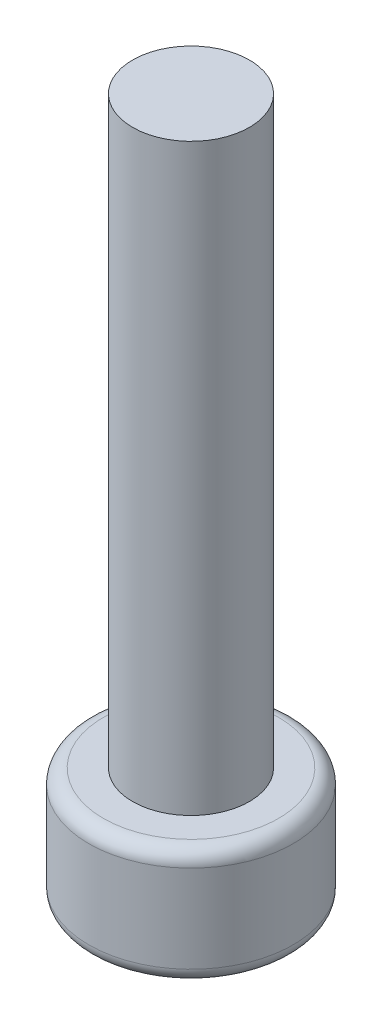
ISO-10303-21;
HEADER;
FILE_DESCRIPTION(('STEP AP214'),'2;1');
FILE_NAME('part.step','',(''),(''),'','','');
FILE_SCHEMA(('AUTOMOTIVE_DESIGN { 1 0 10303 214 1 1 1 1 }'));
ENDSEC;
DATA;
#1=APPLICATION_CONTEXT('core data for automotive mechanical design processes');
#2=APPLICATION_PROTOCOL_DEFINITION('international standard','automotive_design',2000,#1);
#3=PRODUCT_CONTEXT('',#1,'mechanical');
#4=PRODUCT('Part','Part','',(#3));
#5=PRODUCT_RELATED_PRODUCT_CATEGORY('part','',(#4));
#6=PRODUCT_DEFINITION_FORMATION('','',#4);
#7=PRODUCT_DEFINITION_CONTEXT('part definition',#1,'design');
#8=PRODUCT_DEFINITION('design','',#6,#7);
#9=PRODUCT_DEFINITION_SHAPE('','',#8);
#10=(LENGTH_UNIT() NAMED_UNIT(*) SI_UNIT(.MILLI.,.METRE.));
#11=(NAMED_UNIT(*) PLANE_ANGLE_UNIT() SI_UNIT($,.RADIAN.));
#12=(NAMED_UNIT(*) SI_UNIT($,.STERADIAN.) SOLID_ANGLE_UNIT());
#13=UNCERTAINTY_MEASURE_WITH_UNIT(LENGTH_MEASURE(1.E-05),#10,'distance_accuracy_value','');
#14=(GEOMETRIC_REPRESENTATION_CONTEXT(3) GLOBAL_UNCERTAINTY_ASSIGNED_CONTEXT((#13)) GLOBAL_UNIT_ASSIGNED_CONTEXT((#10,
#11,#12)) REPRESENTATION_CONTEXT('',''));
#15=CARTESIAN_POINT('',(0.,0.,0.));
#16=DIRECTION('',(0.,0.,1.));
#17=DIRECTION('',(1.,0.,0.));
#18=AXIS2_PLACEMENT_3D('',#15,#16,#17);
#19=CARTESIAN_POINT('',(0.,4.,0.));
#20=DIRECTION('',(0.,-1.,0.));
#21=DIRECTION('',(0.,0.,-1.));
#22=AXIS2_PLACEMENT_3D('',#19,#20,#21);
#23=CYLINDRICAL_SURFACE('',#22,3.5);
#24=CARTESIAN_POINT('',(0.,0.5,0.));
#25=DIRECTION('',(0.,1.,0.));
#26=DIRECTION('',(0.,0.,1.));
#27=AXIS2_PLACEMENT_3D('',#24,#25,#26);
#28=CIRCLE('',#27,3.5);
#29=CARTESIAN_POINT('',(0.,0.5,3.5));
#30=VERTEX_POINT('',#29);
#31=EDGE_CURVE('E154',#30,#30,#28,.T.);
#32=ORIENTED_EDGE('',*,*,#31,.T.);
#33=EDGE_LOOP('',(#32));
#34=FACE_BOUND('',#33,.T.);
#35=CARTESIAN_POINT('',(0.,3.5,0.));
#36=DIRECTION('',(0.,1.,0.));
#37=DIRECTION('',(0.,0.,1.));
#38=AXIS2_PLACEMENT_3D('',#35,#36,#37);
#39=CIRCLE('',#38,3.5);
#40=CARTESIAN_POINT('',(0.,3.5,3.5));
#41=VERTEX_POINT('',#40);
#42=EDGE_CURVE('E151',#41,#41,#39,.F.);
#43=ORIENTED_EDGE('',*,*,#42,.T.);
#44=EDGE_LOOP('',(#43));
#45=FACE_BOUND('',#44,.T.);
#46=ADVANCED_FACE('F38',(#34,#45),#23,.T.);
#47=CARTESIAN_POINT('',(0.,4.,0.));
#48=DIRECTION('',(0.,1.,0.));
#49=DIRECTION('',(0.,0.,1.));
#50=AXIS2_PLACEMENT_3D('',#47,#48,#49);
#51=PLANE('',#50);
#52=CARTESIAN_POINT('',(0.,4.,0.));
#53=DIRECTION('',(0.,1.,0.));
#54=DIRECTION('',(0.,0.,1.));
#55=AXIS2_PLACEMENT_3D('',#52,#53,#54);
#56=CIRCLE('',#55,3.);
#57=CARTESIAN_POINT('',(0.,4.,3.));
#58=VERTEX_POINT('',#57);
#59=EDGE_CURVE('E11',#58,#58,#56,.T.);
#60=ORIENTED_EDGE('',*,*,#59,.T.);
#61=EDGE_LOOP('',(#60));
#62=FACE_BOUND('',#61,.T.);
#63=CARTESIAN_POINT('',(0.,4.,0.));
#64=DIRECTION('',(0.,1.,0.));
#65=DIRECTION('',(0.,0.,1.));
#66=AXIS2_PLACEMENT_3D('',#63,#64,#65);
#67=CIRCLE('',#66,2.);
#68=CARTESIAN_POINT('',(0.,4.,2.));
#69=VERTEX_POINT('',#68);
#70=EDGE_CURVE('E148',#69,#69,#67,.T.);
#71=ORIENTED_EDGE('',*,*,#70,.F.);
#72=EDGE_LOOP('',(#71));
#73=FACE_BOUND('',#72,.T.);
#74=ADVANCED_FACE('F169',(#62,#73),#51,.T.);
#75=CARTESIAN_POINT('',(0.,0.,0.));
#76=DIRECTION('',(0.,1.,0.));
#77=DIRECTION('',(0.,0.,1.));
#78=AXIS2_PLACEMENT_3D('',#75,#76,#77);
#79=PLANE('',#78);
#80=CARTESIAN_POINT('',(0.,0.,0.));
#81=DIRECTION('',(0.,1.,0.));
#82=DIRECTION('',(0.,0.,1.));
#83=AXIS2_PLACEMENT_3D('',#80,#81,#82);
#84=CIRCLE('',#83,3.);
#85=CARTESIAN_POINT('',(0.,0.,3.));
#86=VERTEX_POINT('',#85);
#87=EDGE_CURVE('E46',#86,#86,#84,.F.);
#88=ORIENTED_EDGE('',*,*,#87,.T.);
#89=EDGE_LOOP('',(#88));
#90=FACE_BOUND('',#89,.T.);
#91=DIRECTION('',(-0.5,0.,0.866025403784439));
#92=VECTOR('',#91,1.);
#93=CARTESIAN_POINT('',(1.5,0.,0.));
#94=LINE('',#93,#92);
#95=CARTESIAN_POINT('',(1.5,0.,0.));
#96=VERTEX_POINT('',#95);
#97=CARTESIAN_POINT('',(0.749999999999999,0.,1.29903810567666));
#98=VERTEX_POINT('',#97);
#99=EDGE_CURVE('E127',#96,#98,#94,.T.);
#100=ORIENTED_EDGE('',*,*,#99,.F.);
#101=DIRECTION('',(0.499999999999999,0.,0.866025403784439));
#102=VECTOR('',#101,1.);
#103=CARTESIAN_POINT('',(0.75,0.,-1.29903810567666));
#104=LINE('',#103,#102);
#105=CARTESIAN_POINT('',(0.75,0.,-1.29903810567666));
#106=VERTEX_POINT('',#105);
#107=EDGE_CURVE('E53',#106,#96,#104,.T.);
#108=ORIENTED_EDGE('',*,*,#107,.F.);
#109=DIRECTION('',(1.,0.,0.));
#110=VECTOR('',#109,1.);
#111=CARTESIAN_POINT('',(-0.75,0.,-1.29903810567666));
#112=LINE('',#111,#110);
#113=CARTESIAN_POINT('',(-0.75,0.,-1.29903810567666));
#114=VERTEX_POINT('',#113);
#115=EDGE_CURVE('E136',#114,#106,#112,.T.);
#116=ORIENTED_EDGE('',*,*,#115,.F.);
#117=DIRECTION('',(0.5,0.,-0.866025403784439));
#118=VECTOR('',#117,1.);
#119=CARTESIAN_POINT('',(-1.5,0.,0.));
#120=LINE('',#119,#118);
#121=CARTESIAN_POINT('',(-1.5,0.,0.));
#122=VERTEX_POINT('',#121);
#123=EDGE_CURVE('E134',#122,#114,#120,.T.);
#124=ORIENTED_EDGE('',*,*,#123,.F.);
#125=DIRECTION('',(-0.5,0.,-0.866025403784439));
#126=VECTOR('',#125,1.);
#127=CARTESIAN_POINT('',(-0.75,0.,1.29903810567666));
#128=LINE('',#127,#126);
#129=CARTESIAN_POINT('',(-0.75,0.,1.29903810567666));
#130=VERTEX_POINT('',#129);
#131=EDGE_CURVE('E101',#130,#122,#128,.T.);
#132=ORIENTED_EDGE('',*,*,#131,.F.);
#133=DIRECTION('',(-1.,0.,0.));
#134=VECTOR('',#133,1.);
#135=CARTESIAN_POINT('',(0.749999999999999,0.,1.29903810567666));
#136=LINE('',#135,#134);
#137=EDGE_CURVE('E130',#98,#130,#136,.T.);
#138=ORIENTED_EDGE('',*,*,#137,.F.);
#139=EDGE_LOOP('',(#100,#108,#116,#124,#132,#138));
#140=FACE_BOUND('',#139,.T.);
#141=ADVANCED_FACE('F159',(#90,#140),#79,.F.);
#142=CARTESIAN_POINT('',(0.,24.,0.));
#143=DIRECTION('',(0.,-1.,0.));
#144=DIRECTION('',(0.,0.,-1.));
#145=AXIS2_PLACEMENT_3D('',#142,#143,#144);
#146=CYLINDRICAL_SURFACE('',#145,2.);
#147=CARTESIAN_POINT('',(0.,24.,0.));
#148=DIRECTION('',(0.,1.,0.));
#149=DIRECTION('',(0.,0.,1.));
#150=AXIS2_PLACEMENT_3D('',#147,#148,#149);
#151=CIRCLE('',#150,2.);
#152=CARTESIAN_POINT('',(0.,24.,2.));
#153=VERTEX_POINT('',#152);
#154=EDGE_CURVE('E140',#153,#153,#151,.T.);
#155=ORIENTED_EDGE('',*,*,#154,.F.);
#156=EDGE_LOOP('',(#155));
#157=FACE_BOUND('',#156,.T.);
#158=ORIENTED_EDGE('',*,*,#70,.T.);
#159=EDGE_LOOP('',(#158));
#160=FACE_BOUND('',#159,.T.);
#161=ADVANCED_FACE('F182',(#157,#160),#146,.T.);
#162=CARTESIAN_POINT('',(0.,24.,0.));
#163=DIRECTION('',(0.,1.,0.));
#164=DIRECTION('',(0.,0.,1.));
#165=AXIS2_PLACEMENT_3D('',#162,#163,#164);
#166=PLANE('',#165);
#167=ORIENTED_EDGE('',*,*,#154,.T.);
#168=EDGE_LOOP('',(#167));
#169=FACE_BOUND('',#168,.T.);
#170=ADVANCED_FACE('F184',(#169),#166,.T.);
#171=CARTESIAN_POINT('',(0.75,2.,-1.29903810567666));
#172=DIRECTION('',(0.866025403784439,0.,-0.499999999999999));
#173=DIRECTION('',(-0.499999999999999,0.,-0.866025403784439));
#174=AXIS2_PLACEMENT_3D('',#171,#172,#173);
#175=PLANE('',#174);
#176=ORIENTED_EDGE('',*,*,#107,.T.);
#177=DIRECTION('',(0.,-1.,0.));
#178=VECTOR('',#177,1.);
#179=CARTESIAN_POINT('',(1.5,2.,0.));
#180=LINE('',#179,#178);
#181=CARTESIAN_POINT('',(1.5,2.,0.));
#182=VERTEX_POINT('',#181);
#183=EDGE_CURVE('E83',#182,#96,#180,.T.);
#184=ORIENTED_EDGE('',*,*,#183,.F.);
#185=DIRECTION('',(0.499999999999999,0.,0.866025403784439));
#186=VECTOR('',#185,1.);
#187=CARTESIAN_POINT('',(0.75,2.,-1.29903810567666));
#188=LINE('',#187,#186);
#189=CARTESIAN_POINT('',(0.75,2.,-1.29903810567666));
#190=VERTEX_POINT('',#189);
#191=EDGE_CURVE('E138',#190,#182,#188,.T.);
#192=ORIENTED_EDGE('',*,*,#191,.F.);
#193=DIRECTION('',(0.,-1.,0.));
#194=VECTOR('',#193,1.);
#195=CARTESIAN_POINT('',(0.75,2.,-1.29903810567666));
#196=LINE('',#195,#194);
#197=EDGE_CURVE('E61',#190,#106,#196,.T.);
#198=ORIENTED_EDGE('',*,*,#197,.T.);
#199=EDGE_LOOP('',(#176,#184,#192,#198));
#200=FACE_BOUND('',#199,.T.);
#201=ADVANCED_FACE('F191',(#200),#175,.F.);
#202=CARTESIAN_POINT('',(-0.75,2.,-1.29903810567666));
#203=DIRECTION('',(0.,0.,-1.));
#204=DIRECTION('',(-1.,0.,0.));
#205=AXIS2_PLACEMENT_3D('',#202,#203,#204);
#206=PLANE('',#205);
#207=ORIENTED_EDGE('',*,*,#115,.T.);
#208=ORIENTED_EDGE('',*,*,#197,.F.);
#209=DIRECTION('',(1.,0.,0.));
#210=VECTOR('',#209,1.);
#211=CARTESIAN_POINT('',(-0.75,2.,-1.29903810567666));
#212=LINE('',#211,#210);
#213=CARTESIAN_POINT('',(-0.75,2.,-1.29903810567666));
#214=VERTEX_POINT('',#213);
#215=EDGE_CURVE('E113',#214,#190,#212,.T.);
#216=ORIENTED_EDGE('',*,*,#215,.F.);
#217=DIRECTION('',(0.,-1.,0.));
#218=VECTOR('',#217,1.);
#219=CARTESIAN_POINT('',(-0.75,2.,-1.29903810567666));
#220=LINE('',#219,#218);
#221=EDGE_CURVE('E105',#214,#114,#220,.T.);
#222=ORIENTED_EDGE('',*,*,#221,.T.);
#223=EDGE_LOOP('',(#207,#208,#216,#222));
#224=FACE_BOUND('',#223,.T.);
#225=ADVANCED_FACE('F199',(#224),#206,.F.);
#226=CARTESIAN_POINT('',(-1.5,2.,0.));
#227=DIRECTION('',(-0.866025403784439,0.,-0.5));
#228=DIRECTION('',(-0.5,0.,0.866025403784439));
#229=AXIS2_PLACEMENT_3D('',#226,#227,#228);
#230=PLANE('',#229);
#231=ORIENTED_EDGE('',*,*,#123,.T.);
#232=ORIENTED_EDGE('',*,*,#221,.F.);
#233=DIRECTION('',(0.5,0.,-0.866025403784439));
#234=VECTOR('',#233,1.);
#235=CARTESIAN_POINT('',(-1.5,2.,0.));
#236=LINE('',#235,#234);
#237=CARTESIAN_POINT('',(-1.5,2.,0.));
#238=VERTEX_POINT('',#237);
#239=EDGE_CURVE('E109',#238,#214,#236,.T.);
#240=ORIENTED_EDGE('',*,*,#239,.F.);
#241=DIRECTION('',(0.,-1.,0.));
#242=VECTOR('',#241,1.);
#243=CARTESIAN_POINT('',(-1.5,2.,0.));
#244=LINE('',#243,#242);
#245=EDGE_CURVE('E94',#238,#122,#244,.T.);
#246=ORIENTED_EDGE('',*,*,#245,.T.);
#247=EDGE_LOOP('',(#231,#232,#240,#246));
#248=FACE_BOUND('',#247,.T.);
#249=ADVANCED_FACE('F110',(#248),#230,.F.);
#250=CARTESIAN_POINT('',(-0.75,2.,1.29903810567666));
#251=DIRECTION('',(-0.866025403784439,0.,0.5));
#252=DIRECTION('',(0.5,0.,0.866025403784439));
#253=AXIS2_PLACEMENT_3D('',#250,#251,#252);
#254=PLANE('',#253);
#255=ORIENTED_EDGE('',*,*,#131,.T.);
#256=ORIENTED_EDGE('',*,*,#245,.F.);
#257=DIRECTION('',(-0.5,0.,-0.866025403784439));
#258=VECTOR('',#257,1.);
#259=CARTESIAN_POINT('',(-0.75,2.,1.29903810567666));
#260=LINE('',#259,#258);
#261=CARTESIAN_POINT('',(-0.75,2.,1.29903810567666));
#262=VERTEX_POINT('',#261);
#263=EDGE_CURVE('E98',#262,#238,#260,.T.);
#264=ORIENTED_EDGE('',*,*,#263,.F.);
#265=DIRECTION('',(0.,-1.,0.));
#266=VECTOR('',#265,1.);
#267=CARTESIAN_POINT('',(-0.75,2.,1.29903810567666));
#268=LINE('',#267,#266);
#269=EDGE_CURVE('E106',#262,#130,#268,.T.);
#270=ORIENTED_EDGE('',*,*,#269,.T.);
#271=EDGE_LOOP('',(#255,#256,#264,#270));
#272=FACE_BOUND('',#271,.T.);
#273=ADVANCED_FACE('F96',(#272),#254,.F.);
#274=CARTESIAN_POINT('',(0.749999999999999,2.,1.29903810567666));
#275=DIRECTION('',(0.,0.,1.));
#276=DIRECTION('',(1.,0.,0.));
#277=AXIS2_PLACEMENT_3D('',#274,#275,#276);
#278=PLANE('',#277);
#279=ORIENTED_EDGE('',*,*,#137,.T.);
#280=ORIENTED_EDGE('',*,*,#269,.F.);
#281=DIRECTION('',(-1.,0.,0.));
#282=VECTOR('',#281,1.);
#283=CARTESIAN_POINT('',(0.749999999999999,2.,1.29903810567666));
#284=LINE('',#283,#282);
#285=CARTESIAN_POINT('',(0.749999999999999,2.,1.29903810567666));
#286=VERTEX_POINT('',#285);
#287=EDGE_CURVE('E119',#286,#262,#284,.T.);
#288=ORIENTED_EDGE('',*,*,#287,.F.);
#289=DIRECTION('',(0.,-1.,0.));
#290=VECTOR('',#289,1.);
#291=CARTESIAN_POINT('',(0.749999999999999,2.,1.29903810567666));
#292=LINE('',#291,#290);
#293=EDGE_CURVE('E143',#286,#98,#292,.T.);
#294=ORIENTED_EDGE('',*,*,#293,.T.);
#295=EDGE_LOOP('',(#279,#280,#288,#294));
#296=FACE_BOUND('',#295,.T.);
#297=ADVANCED_FACE('F203',(#296),#278,.F.);
#298=CARTESIAN_POINT('',(1.5,2.,0.));
#299=DIRECTION('',(0.866025403784439,0.,0.5));
#300=DIRECTION('',(0.5,0.,-0.866025403784439));
#301=AXIS2_PLACEMENT_3D('',#298,#299,#300);
#302=PLANE('',#301);
#303=ORIENTED_EDGE('',*,*,#99,.T.);
#304=ORIENTED_EDGE('',*,*,#293,.F.);
#305=DIRECTION('',(-0.5,0.,0.866025403784439));
#306=VECTOR('',#305,1.);
#307=CARTESIAN_POINT('',(1.5,2.,0.));
#308=LINE('',#307,#306);
#309=EDGE_CURVE('E121',#182,#286,#308,.T.);
#310=ORIENTED_EDGE('',*,*,#309,.F.);
#311=ORIENTED_EDGE('',*,*,#183,.T.);
#312=EDGE_LOOP('',(#303,#304,#310,#311));
#313=FACE_BOUND('',#312,.T.);
#314=ADVANCED_FACE('F200',(#313),#302,.F.);
#315=CARTESIAN_POINT('',(0.,2.,0.));
#316=DIRECTION('',(0.,-1.,0.));
#317=DIRECTION('',(0.,0.,-1.));
#318=AXIS2_PLACEMENT_3D('',#315,#316,#317);
#319=PLANE('',#318);
#320=ORIENTED_EDGE('',*,*,#191,.T.);
#321=ORIENTED_EDGE('',*,*,#309,.T.);
#322=ORIENTED_EDGE('',*,*,#287,.T.);
#323=ORIENTED_EDGE('',*,*,#263,.T.);
#324=ORIENTED_EDGE('',*,*,#239,.T.);
#325=ORIENTED_EDGE('',*,*,#215,.T.);
#326=EDGE_LOOP('',(#320,#321,#322,#323,#324,#325));
#327=FACE_BOUND('',#326,.T.);
#328=ADVANCED_FACE('F116',(#327),#319,.T.);
#329=CARTESIAN_POINT('',(0.,0.5,0.));
#330=DIRECTION('',(0.,1.,0.));
#331=DIRECTION('',(0.,0.,1.));
#332=AXIS2_PLACEMENT_3D('',#329,#330,#331);
#333=TOROIDAL_SURFACE('',#332,3.,0.5);
#334=ORIENTED_EDGE('',*,*,#87,.F.);
#335=EDGE_LOOP('',(#334));
#336=FACE_BOUND('',#335,.T.);
#337=ORIENTED_EDGE('',*,*,#31,.F.);
#338=EDGE_LOOP('',(#337));
#339=FACE_BOUND('',#338,.T.);
#340=ADVANCED_FACE('F162',(#336,#339),#333,.T.);
#341=CARTESIAN_POINT('',(0.,3.5,0.));
#342=DIRECTION('',(0.,1.,0.));
#343=DIRECTION('',(0.,0.,1.));
#344=AXIS2_PLACEMENT_3D('',#341,#342,#343);
#345=TOROIDAL_SURFACE('',#344,3.,0.5);
#346=ORIENTED_EDGE('',*,*,#42,.F.);
#347=EDGE_LOOP('',(#346));
#348=FACE_BOUND('',#347,.T.);
#349=ORIENTED_EDGE('',*,*,#59,.F.);
#350=EDGE_LOOP('',(#349));
#351=FACE_BOUND('',#350,.T.);
#352=ADVANCED_FACE('F40',(#348,#351),#345,.T.);
#353=CLOSED_SHELL('',(#46,#74,#141,#161,#170,#201,#225,#249,#273,#297,#314,#328,#340,#352));
#354=MANIFOLD_SOLID_BREP('B2',#353);
#355=ADVANCED_BREP_SHAPE_REPRESENTATION('',(#18,#354),#14);
#356=SHAPE_DEFINITION_REPRESENTATION(#9,#355);
ENDSEC;
END-ISO-10303-21;
